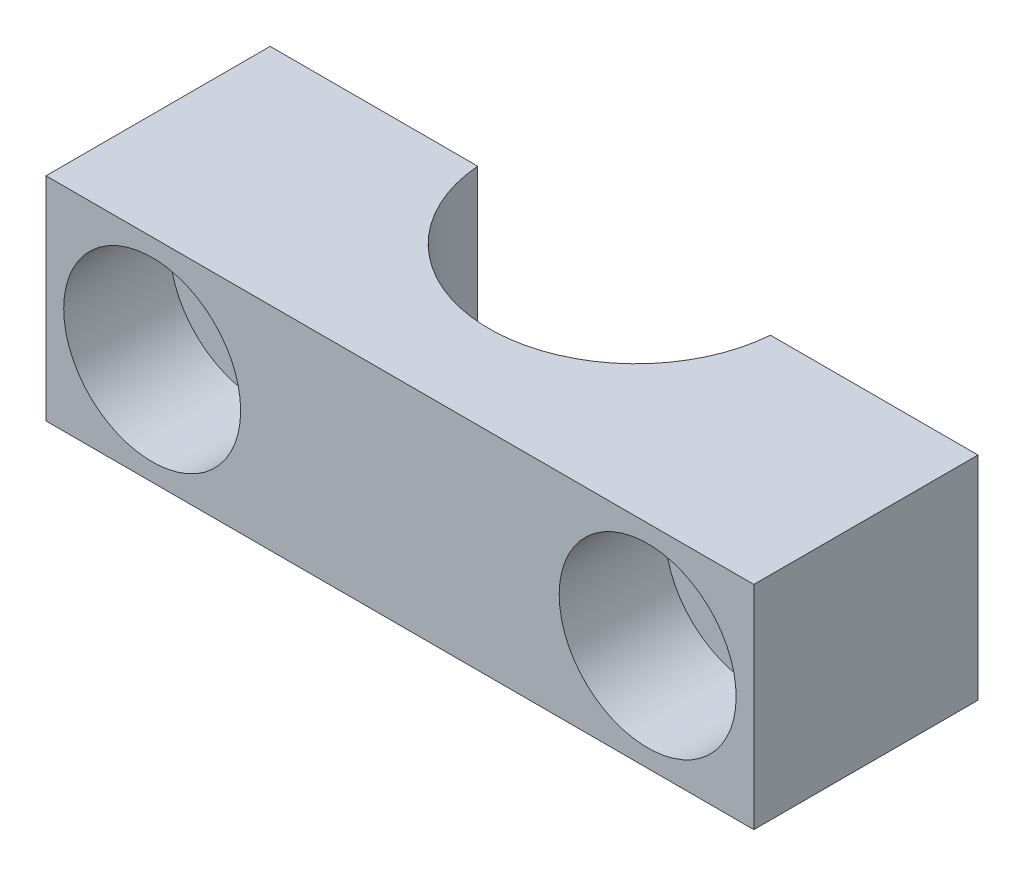
ISO-10303-21;
HEADER;
FILE_DESCRIPTION(('STEP AP214'),'2;1');
FILE_NAME('part.step','',(''),(''),'','','');
FILE_SCHEMA(('AUTOMOTIVE_DESIGN { 1 0 10303 214 1 1 1 1 }'));
ENDSEC;
DATA;
#1=APPLICATION_CONTEXT('core data for automotive mechanical design processes');
#2=APPLICATION_PROTOCOL_DEFINITION('international standard','automotive_design',2000,#1);
#3=PRODUCT_CONTEXT('',#1,'mechanical');
#4=PRODUCT('Part','Part','',(#3));
#5=PRODUCT_RELATED_PRODUCT_CATEGORY('part','',(#4));
#6=PRODUCT_DEFINITION_FORMATION('','',#4);
#7=PRODUCT_DEFINITION_CONTEXT('part definition',#1,'design');
#8=PRODUCT_DEFINITION('design','',#6,#7);
#9=PRODUCT_DEFINITION_SHAPE('','',#8);
#10=(LENGTH_UNIT() NAMED_UNIT(*) SI_UNIT(.MILLI.,.METRE.));
#11=(NAMED_UNIT(*) PLANE_ANGLE_UNIT() SI_UNIT($,.RADIAN.));
#12=(NAMED_UNIT(*) SI_UNIT($,.STERADIAN.) SOLID_ANGLE_UNIT());
#13=UNCERTAINTY_MEASURE_WITH_UNIT(LENGTH_MEASURE(1.E-05),#10,'distance_accuracy_value','');
#14=(GEOMETRIC_REPRESENTATION_CONTEXT(3) GLOBAL_UNCERTAINTY_ASSIGNED_CONTEXT((#13)) GLOBAL_UNIT_ASSIGNED_CONTEXT((#10,
#11,#12)) REPRESENTATION_CONTEXT('',''));
#15=CARTESIAN_POINT('',(0.,0.,0.));
#16=DIRECTION('',(0.,0.,1.));
#17=DIRECTION('',(1.,0.,0.));
#18=AXIS2_PLACEMENT_3D('',#15,#16,#17);
#19=CARTESIAN_POINT('',(-30.,18.,-9.5));
#20=DIRECTION('',(0.,0.,1.));
#21=DIRECTION('',(1.,0.,0.));
#22=AXIS2_PLACEMENT_3D('',#19,#20,#21);
#23=PLANE('',#22);
#24=CARTESIAN_POINT('',(21.,9.,-9.5));
#25=DIRECTION('',(0.,0.,1.));
#26=DIRECTION('',(1.,0.,0.));
#27=AXIS2_PLACEMENT_3D('',#24,#25,#26);
#28=CIRCLE('',#27,5.);
#29=CARTESIAN_POINT('',(26.,9.,-9.5));
#30=VERTEX_POINT('',#29);
#31=EDGE_CURVE('E123',#30,#30,#28,.T.);
#32=ORIENTED_EDGE('',*,*,#31,.T.);
#33=EDGE_LOOP('',(#32));
#34=FACE_BOUND('',#33,.T.);
#35=DIRECTION('',(-1.,0.,0.));
#36=VECTOR('',#35,1.);
#37=CARTESIAN_POINT('',(-30.,0.,-9.5));
#38=LINE('',#37,#36);
#39=CARTESIAN_POINT('',(30.,0.,-9.5));
#40=VERTEX_POINT('',#39);
#41=CARTESIAN_POINT('',(12.4097743734526,0.,-9.5));
#42=VERTEX_POINT('',#41);
#43=EDGE_CURVE('E95',#40,#42,#38,.T.);
#44=ORIENTED_EDGE('',*,*,#43,.T.);
#45=DIRECTION('',(0.,1.,0.));
#46=VECTOR('',#45,1.);
#47=CARTESIAN_POINT('',(12.4097743734526,0.,-9.5));
#48=LINE('',#47,#46);
#49=CARTESIAN_POINT('',(12.4097743734526,18.,-9.5));
#50=VERTEX_POINT('',#49);
#51=EDGE_CURVE('E31',#42,#50,#48,.T.);
#52=ORIENTED_EDGE('',*,*,#51,.T.);
#53=DIRECTION('',(-1.,0.,0.));
#54=VECTOR('',#53,1.);
#55=CARTESIAN_POINT('',(-30.,18.,-9.5));
#56=LINE('',#55,#54);
#57=CARTESIAN_POINT('',(30.,18.,-9.5));
#58=VERTEX_POINT('',#57);
#59=EDGE_CURVE('E68',#58,#50,#56,.T.);
#60=ORIENTED_EDGE('',*,*,#59,.F.);
#61=DIRECTION('',(0.,-1.,0.));
#62=VECTOR('',#61,1.);
#63=CARTESIAN_POINT('',(30.,18.,-9.5));
#64=LINE('',#63,#62);
#65=EDGE_CURVE('E25',#58,#40,#64,.T.);
#66=ORIENTED_EDGE('',*,*,#65,.T.);
#67=EDGE_LOOP('',(#44,#52,#60,#66));
#68=FACE_BOUND('',#67,.T.);
#69=ADVANCED_FACE('F17',(#34,#68),#23,.F.);
#70=CARTESIAN_POINT('',(30.,18.,9.5));
#71=DIRECTION('',(-1.,0.,0.));
#72=DIRECTION('',(0.,0.,1.));
#73=AXIS2_PLACEMENT_3D('',#70,#71,#72);
#74=PLANE('',#73);
#75=DIRECTION('',(0.,0.,-1.));
#76=VECTOR('',#75,1.);
#77=CARTESIAN_POINT('',(30.,0.,9.5));
#78=LINE('',#77,#76);
#79=CARTESIAN_POINT('',(30.,0.,9.5));
#80=VERTEX_POINT('',#79);
#81=EDGE_CURVE('E96',#80,#40,#78,.T.);
#82=ORIENTED_EDGE('',*,*,#81,.T.);
#83=ORIENTED_EDGE('',*,*,#65,.F.);
#84=DIRECTION('',(0.,0.,-1.));
#85=VECTOR('',#84,1.);
#86=CARTESIAN_POINT('',(30.,18.,9.5));
#87=LINE('',#86,#85);
#88=CARTESIAN_POINT('',(30.,18.,9.5));
#89=VERTEX_POINT('',#88);
#90=EDGE_CURVE('E104',#89,#58,#87,.T.);
#91=ORIENTED_EDGE('',*,*,#90,.F.);
#92=DIRECTION('',(0.,-1.,0.));
#93=VECTOR('',#92,1.);
#94=CARTESIAN_POINT('',(30.,18.,9.5));
#95=LINE('',#94,#93);
#96=EDGE_CURVE('E105',#89,#80,#95,.T.);
#97=ORIENTED_EDGE('',*,*,#96,.T.);
#98=EDGE_LOOP('',(#82,#83,#91,#97));
#99=FACE_BOUND('',#98,.T.);
#100=ADVANCED_FACE('F19',(#99),#74,.F.);
#101=CARTESIAN_POINT('',(-21.,9.,-9.5));
#102=DIRECTION('',(0.,0.,1.));
#103=DIRECTION('',(1.,0.,0.));
#104=AXIS2_PLACEMENT_3D('',#101,#102,#103);
#105=CIRCLE('',#104,5.);
#106=CARTESIAN_POINT('',(-16.,9.,-9.5));
#107=VERTEX_POINT('',#106);
#108=EDGE_CURVE('E135',#107,#107,#105,.T.);
#109=ORIENTED_EDGE('',*,*,#108,.T.);
#110=EDGE_LOOP('',(#109));
#111=FACE_BOUND('',#110,.T.);
#112=CARTESIAN_POINT('',(-12.4097743734526,18.,-9.5));
#113=VERTEX_POINT('',#112);
#114=CARTESIAN_POINT('',(-30.,18.,-9.5));
#115=VERTEX_POINT('',#114);
#116=EDGE_CURVE('E89',#113,#115,#56,.T.);
#117=ORIENTED_EDGE('',*,*,#116,.F.);
#118=DIRECTION('',(0.,1.,0.));
#119=VECTOR('',#118,1.);
#120=CARTESIAN_POINT('',(-12.4097743734526,0.,-9.5));
#121=LINE('',#120,#119);
#122=CARTESIAN_POINT('',(-12.4097743734526,0.,-9.5));
#123=VERTEX_POINT('',#122);
#124=EDGE_CURVE('E78',#113,#123,#121,.F.);
#125=ORIENTED_EDGE('',*,*,#124,.T.);
#126=CARTESIAN_POINT('',(-30.,0.,-9.5));
#127=VERTEX_POINT('',#126);
#128=EDGE_CURVE('E87',#123,#127,#38,.T.);
#129=ORIENTED_EDGE('',*,*,#128,.T.);
#130=DIRECTION('',(0.,-1.,0.));
#131=VECTOR('',#130,1.);
#132=CARTESIAN_POINT('',(-30.,18.,-9.5));
#133=LINE('',#132,#131);
#134=EDGE_CURVE('E109',#115,#127,#133,.T.);
#135=ORIENTED_EDGE('',*,*,#134,.F.);
#136=EDGE_LOOP('',(#117,#125,#129,#135));
#137=FACE_BOUND('',#136,.T.);
#138=ADVANCED_FACE('F85',(#111,#137),#23,.F.);
#139=CARTESIAN_POINT('',(-30.,18.,9.5));
#140=DIRECTION('',(1.,0.,0.));
#141=DIRECTION('',(0.,0.,-1.));
#142=AXIS2_PLACEMENT_3D('',#139,#140,#141);
#143=PLANE('',#142);
#144=DIRECTION('',(0.,0.,1.));
#145=VECTOR('',#144,1.);
#146=CARTESIAN_POINT('',(-30.,0.,9.5));
#147=LINE('',#146,#145);
#148=CARTESIAN_POINT('',(-30.,0.,9.5));
#149=VERTEX_POINT('',#148);
#150=EDGE_CURVE('E94',#127,#149,#147,.T.);
#151=ORIENTED_EDGE('',*,*,#150,.T.);
#152=DIRECTION('',(0.,-1.,0.));
#153=VECTOR('',#152,1.);
#154=CARTESIAN_POINT('',(-30.,18.,9.5));
#155=LINE('',#154,#153);
#156=CARTESIAN_POINT('',(-30.,18.,9.5));
#157=VERTEX_POINT('',#156);
#158=EDGE_CURVE('E107',#157,#149,#155,.T.);
#159=ORIENTED_EDGE('',*,*,#158,.F.);
#160=DIRECTION('',(0.,0.,1.));
#161=VECTOR('',#160,1.);
#162=CARTESIAN_POINT('',(-30.,18.,9.5));
#163=LINE('',#162,#161);
#164=EDGE_CURVE('E116',#115,#157,#163,.T.);
#165=ORIENTED_EDGE('',*,*,#164,.F.);
#166=ORIENTED_EDGE('',*,*,#134,.T.);
#167=EDGE_LOOP('',(#151,#159,#165,#166));
#168=FACE_BOUND('',#167,.T.);
#169=ADVANCED_FACE('F153',(#168),#143,.F.);
#170=CARTESIAN_POINT('',(-30.,18.,9.5));
#171=DIRECTION('',(0.,0.,-1.));
#172=DIRECTION('',(-1.,0.,0.));
#173=AXIS2_PLACEMENT_3D('',#170,#171,#172);
#174=PLANE('',#173);
#175=CARTESIAN_POINT('',(-21.,9.,9.5));
#176=DIRECTION('',(0.,0.,1.));
#177=DIRECTION('',(1.,0.,0.));
#178=AXIS2_PLACEMENT_3D('',#175,#176,#177);
#179=CIRCLE('',#178,7.5);
#180=CARTESIAN_POINT('',(-13.5,9.,9.5));
#181=VERTEX_POINT('',#180);
#182=EDGE_CURVE('E144',#181,#181,#179,.T.);
#183=ORIENTED_EDGE('',*,*,#182,.F.);
#184=EDGE_LOOP('',(#183));
#185=FACE_BOUND('',#184,.T.);
#186=CARTESIAN_POINT('',(21.,9.,9.5));
#187=DIRECTION('',(0.,0.,1.));
#188=DIRECTION('',(1.,0.,0.));
#189=AXIS2_PLACEMENT_3D('',#186,#187,#188);
#190=CIRCLE('',#189,7.5);
#191=CARTESIAN_POINT('',(28.5,9.,9.5));
#192=VERTEX_POINT('',#191);
#193=EDGE_CURVE('E132',#192,#192,#190,.T.);
#194=ORIENTED_EDGE('',*,*,#193,.F.);
#195=EDGE_LOOP('',(#194));
#196=FACE_BOUND('',#195,.T.);
#197=DIRECTION('',(1.,0.,0.));
#198=VECTOR('',#197,1.);
#199=CARTESIAN_POINT('',(-30.,0.,9.5));
#200=LINE('',#199,#198);
#201=EDGE_CURVE('E61',#149,#80,#200,.T.);
#202=ORIENTED_EDGE('',*,*,#201,.T.);
#203=ORIENTED_EDGE('',*,*,#96,.F.);
#204=DIRECTION('',(1.,0.,0.));
#205=VECTOR('',#204,1.);
#206=CARTESIAN_POINT('',(-30.,18.,9.5));
#207=LINE('',#206,#205);
#208=EDGE_CURVE('E40',#157,#89,#207,.T.);
#209=ORIENTED_EDGE('',*,*,#208,.F.);
#210=ORIENTED_EDGE('',*,*,#158,.T.);
#211=EDGE_LOOP('',(#202,#203,#209,#210));
#212=FACE_BOUND('',#211,.T.);
#213=ADVANCED_FACE('F114',(#185,#196,#212),#174,.F.);
#214=CARTESIAN_POINT('',(0.,18.,0.));
#215=DIRECTION('',(0.,-1.,0.));
#216=DIRECTION('',(0.,0.,-1.));
#217=AXIS2_PLACEMENT_3D('',#214,#215,#216);
#218=PLANE('',#217);
#219=ORIENTED_EDGE('',*,*,#59,.T.);
#220=CARTESIAN_POINT('',(0.,18.,-10.5));
#221=DIRECTION('',(0.,1.,0.));
#222=DIRECTION('',(0.,0.,1.));
#223=AXIS2_PLACEMENT_3D('',#220,#221,#222);
#224=CIRCLE('',#223,12.45);
#225=EDGE_CURVE('E90',#113,#50,#224,.T.);
#226=ORIENTED_EDGE('',*,*,#225,.F.);
#227=ORIENTED_EDGE('',*,*,#116,.T.);
#228=ORIENTED_EDGE('',*,*,#164,.T.);
#229=ORIENTED_EDGE('',*,*,#208,.T.);
#230=ORIENTED_EDGE('',*,*,#90,.T.);
#231=EDGE_LOOP('',(#219,#226,#227,#228,#229,#230));
#232=FACE_BOUND('',#231,.T.);
#233=ADVANCED_FACE('F152',(#232),#218,.F.);
#234=CARTESIAN_POINT('',(0.,0.,0.));
#235=DIRECTION('',(0.,-1.,0.));
#236=DIRECTION('',(0.,0.,-1.));
#237=AXIS2_PLACEMENT_3D('',#234,#235,#236);
#238=PLANE('',#237);
#239=CARTESIAN_POINT('',(0.,0.,-10.5));
#240=DIRECTION('',(0.,-1.,0.));
#241=DIRECTION('',(0.,0.,-1.));
#242=AXIS2_PLACEMENT_3D('',#239,#240,#241);
#243=CIRCLE('',#242,12.45);
#244=EDGE_CURVE('E11',#42,#123,#243,.T.);
#245=ORIENTED_EDGE('',*,*,#244,.F.);
#246=ORIENTED_EDGE('',*,*,#43,.F.);
#247=ORIENTED_EDGE('',*,*,#81,.F.);
#248=ORIENTED_EDGE('',*,*,#201,.F.);
#249=ORIENTED_EDGE('',*,*,#150,.F.);
#250=ORIENTED_EDGE('',*,*,#128,.F.);
#251=EDGE_LOOP('',(#245,#246,#247,#248,#249,#250));
#252=FACE_BOUND('',#251,.T.);
#253=ADVANCED_FACE('F93',(#252),#238,.T.);
#254=CARTESIAN_POINT('',(0.,0.,-10.5));
#255=DIRECTION('',(0.,1.,0.));
#256=DIRECTION('',(0.,0.,1.));
#257=AXIS2_PLACEMENT_3D('',#254,#255,#256);
#258=CYLINDRICAL_SURFACE('',#257,12.45);
#259=ORIENTED_EDGE('',*,*,#244,.T.);
#260=ORIENTED_EDGE('',*,*,#124,.F.);
#261=ORIENTED_EDGE('',*,*,#225,.T.);
#262=ORIENTED_EDGE('',*,*,#51,.F.);
#263=EDGE_LOOP('',(#259,#260,#261,#262));
#264=FACE_BOUND('',#263,.T.);
#265=ADVANCED_FACE('F77',(#264),#258,.F.);
#266=CARTESIAN_POINT('',(21.,9.,9.5));
#267=DIRECTION('',(0.,0.,1.));
#268=DIRECTION('',(1.,0.,0.));
#269=AXIS2_PLACEMENT_3D('',#266,#267,#268);
#270=CYLINDRICAL_SURFACE('',#269,5.);
#271=ORIENTED_EDGE('',*,*,#31,.F.);
#272=EDGE_LOOP('',(#271));
#273=FACE_BOUND('',#272,.T.);
#274=CARTESIAN_POINT('',(21.,9.,0.5));
#275=DIRECTION('',(0.,0.,1.));
#276=DIRECTION('',(1.,0.,0.));
#277=AXIS2_PLACEMENT_3D('',#274,#275,#276);
#278=CIRCLE('',#277,5.);
#279=CARTESIAN_POINT('',(26.,9.,0.5));
#280=VERTEX_POINT('',#279);
#281=EDGE_CURVE('E126',#280,#280,#278,.T.);
#282=ORIENTED_EDGE('',*,*,#281,.T.);
#283=EDGE_LOOP('',(#282));
#284=FACE_BOUND('',#283,.T.);
#285=ADVANCED_FACE('F171',(#273,#284),#270,.F.);
#286=CARTESIAN_POINT('',(26.,9.,0.5));
#287=DIRECTION('',(0.,0.,-1.));
#288=DIRECTION('',(-1.,0.,0.));
#289=AXIS2_PLACEMENT_3D('',#286,#287,#288);
#290=PLANE('',#289);
#291=ORIENTED_EDGE('',*,*,#281,.F.);
#292=EDGE_LOOP('',(#291));
#293=FACE_BOUND('',#292,.T.);
#294=CARTESIAN_POINT('',(21.,9.,0.5));
#295=DIRECTION('',(0.,0.,1.));
#296=DIRECTION('',(1.,0.,0.));
#297=AXIS2_PLACEMENT_3D('',#294,#295,#296);
#298=CIRCLE('',#297,7.5);
#299=CARTESIAN_POINT('',(28.5,9.,0.5));
#300=VERTEX_POINT('',#299);
#301=EDGE_CURVE('E129',#300,#300,#298,.T.);
#302=ORIENTED_EDGE('',*,*,#301,.T.);
#303=EDGE_LOOP('',(#302));
#304=FACE_BOUND('',#303,.T.);
#305=ADVANCED_FACE('F160',(#293,#304),#290,.F.);
#306=CARTESIAN_POINT('',(21.,9.,9.5));
#307=DIRECTION('',(0.,0.,1.));
#308=DIRECTION('',(1.,0.,0.));
#309=AXIS2_PLACEMENT_3D('',#306,#307,#308);
#310=CYLINDRICAL_SURFACE('',#309,7.5);
#311=ORIENTED_EDGE('',*,*,#301,.F.);
#312=EDGE_LOOP('',(#311));
#313=FACE_BOUND('',#312,.T.);
#314=ORIENTED_EDGE('',*,*,#193,.T.);
#315=EDGE_LOOP('',(#314));
#316=FACE_BOUND('',#315,.T.);
#317=ADVANCED_FACE('F157',(#313,#316),#310,.F.);
#318=CARTESIAN_POINT('',(-21.,9.,9.5));
#319=DIRECTION('',(0.,0.,1.));
#320=DIRECTION('',(1.,0.,0.));
#321=AXIS2_PLACEMENT_3D('',#318,#319,#320);
#322=CYLINDRICAL_SURFACE('',#321,5.);
#323=ORIENTED_EDGE('',*,*,#108,.F.);
#324=EDGE_LOOP('',(#323));
#325=FACE_BOUND('',#324,.T.);
#326=CARTESIAN_POINT('',(-21.,9.,0.5));
#327=DIRECTION('',(0.,0.,1.));
#328=DIRECTION('',(1.,0.,0.));
#329=AXIS2_PLACEMENT_3D('',#326,#327,#328);
#330=CIRCLE('',#329,5.);
#331=CARTESIAN_POINT('',(-16.,9.,0.5));
#332=VERTEX_POINT('',#331);
#333=EDGE_CURVE('E138',#332,#332,#330,.T.);
#334=ORIENTED_EDGE('',*,*,#333,.T.);
#335=EDGE_LOOP('',(#334));
#336=FACE_BOUND('',#335,.T.);
#337=ADVANCED_FACE('F159',(#325,#336),#322,.F.);
#338=CARTESIAN_POINT('',(-16.,9.,0.5));
#339=DIRECTION('',(0.,0.,-1.));
#340=DIRECTION('',(-1.,0.,0.));
#341=AXIS2_PLACEMENT_3D('',#338,#339,#340);
#342=PLANE('',#341);
#343=ORIENTED_EDGE('',*,*,#333,.F.);
#344=EDGE_LOOP('',(#343));
#345=FACE_BOUND('',#344,.T.);
#346=CARTESIAN_POINT('',(-21.,9.,0.5));
#347=DIRECTION('',(0.,0.,1.));
#348=DIRECTION('',(1.,0.,0.));
#349=AXIS2_PLACEMENT_3D('',#346,#347,#348);
#350=CIRCLE('',#349,7.5);
#351=CARTESIAN_POINT('',(-13.5,9.,0.5));
#352=VERTEX_POINT('',#351);
#353=EDGE_CURVE('E141',#352,#352,#350,.T.);
#354=ORIENTED_EDGE('',*,*,#353,.T.);
#355=EDGE_LOOP('',(#354));
#356=FACE_BOUND('',#355,.T.);
#357=ADVANCED_FACE('F168',(#345,#356),#342,.F.);
#358=CARTESIAN_POINT('',(-21.,9.,9.5));
#359=DIRECTION('',(0.,0.,1.));
#360=DIRECTION('',(1.,0.,0.));
#361=AXIS2_PLACEMENT_3D('',#358,#359,#360);
#362=CYLINDRICAL_SURFACE('',#361,7.5);
#363=ORIENTED_EDGE('',*,*,#353,.F.);
#364=EDGE_LOOP('',(#363));
#365=FACE_BOUND('',#364,.T.);
#366=ORIENTED_EDGE('',*,*,#182,.T.);
#367=EDGE_LOOP('',(#366));
#368=FACE_BOUND('',#367,.T.);
#369=ADVANCED_FACE('F148',(#365,#368),#362,.F.);
#370=CLOSED_SHELL('',(#69,#100,#138,#169,#213,#233,#253,#265,#285,#305,#317,#337,#357,#369));
#371=MANIFOLD_SOLID_BREP('B1',#370);
#372=ADVANCED_BREP_SHAPE_REPRESENTATION('',(#18,#371),#14);
#373=SHAPE_DEFINITION_REPRESENTATION(#9,#372);
ENDSEC;
END-ISO-10303-21;
